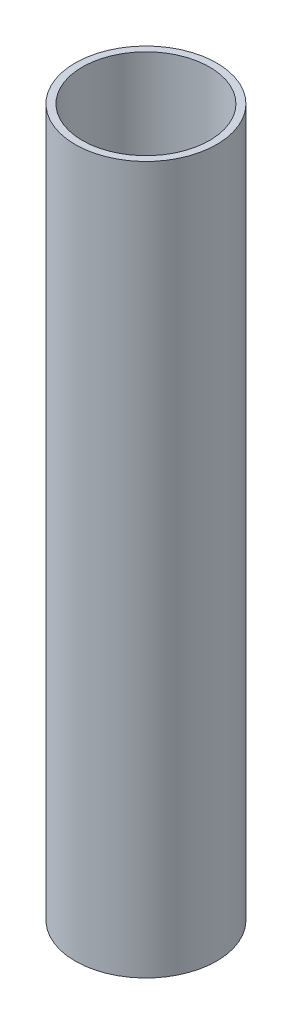
ISO-10303-21;
HEADER;
FILE_DESCRIPTION(('STEP AP214'),'2;1');
FILE_NAME('part.step','',(''),(''),'','','');
FILE_SCHEMA(('AUTOMOTIVE_DESIGN { 1 0 10303 214 1 1 1 1 }'));
ENDSEC;
DATA;
#1=APPLICATION_CONTEXT('core data for automotive mechanical design processes');
#2=APPLICATION_PROTOCOL_DEFINITION('international standard','automotive_design',2000,#1);
#3=PRODUCT_CONTEXT('',#1,'mechanical');
#4=PRODUCT('Part','Part','',(#3));
#5=PRODUCT_RELATED_PRODUCT_CATEGORY('part','',(#4));
#6=PRODUCT_DEFINITION_FORMATION('','',#4);
#7=PRODUCT_DEFINITION_CONTEXT('part definition',#1,'design');
#8=PRODUCT_DEFINITION('design','',#6,#7);
#9=PRODUCT_DEFINITION_SHAPE('','',#8);
#10=(LENGTH_UNIT() NAMED_UNIT(*) SI_UNIT(.MILLI.,.METRE.));
#11=(NAMED_UNIT(*) PLANE_ANGLE_UNIT() SI_UNIT($,.RADIAN.));
#12=(NAMED_UNIT(*) SI_UNIT($,.STERADIAN.) SOLID_ANGLE_UNIT());
#13=UNCERTAINTY_MEASURE_WITH_UNIT(LENGTH_MEASURE(1.E-05),#10,'distance_accuracy_value','');
#14=(GEOMETRIC_REPRESENTATION_CONTEXT(3) GLOBAL_UNCERTAINTY_ASSIGNED_CONTEXT((#13)) GLOBAL_UNIT_ASSIGNED_CONTEXT((#10,
#11,#12)) REPRESENTATION_CONTEXT('',''));
#15=CARTESIAN_POINT('',(0.,0.,0.));
#16=DIRECTION('',(0.,0.,1.));
#17=DIRECTION('',(1.,0.,0.));
#18=AXIS2_PLACEMENT_3D('',#15,#16,#17);
#19=CARTESIAN_POINT('',(0.,200.,0.));
#20=DIRECTION('',(0.,1.,0.));
#21=DIRECTION('',(0.,0.,1.));
#22=AXIS2_PLACEMENT_3D('',#19,#20,#21);
#23=PLANE('',#22);
#24=CARTESIAN_POINT('',(0.,200.,0.));
#25=DIRECTION('',(0.,1.,0.));
#26=DIRECTION('',(0.,0.,1.));
#27=AXIS2_PLACEMENT_3D('',#24,#25,#26);
#28=CIRCLE('',#27,20.);
#29=CARTESIAN_POINT('',(0.,200.,20.));
#30=VERTEX_POINT('',#29);
#31=EDGE_CURVE('E10',#30,#30,#28,.T.);
#32=ORIENTED_EDGE('',*,*,#31,.T.);
#33=EDGE_LOOP('',(#32));
#34=FACE_BOUND('',#33,.T.);
#35=CARTESIAN_POINT('',(0.,200.,0.));
#36=DIRECTION('',(0.,1.,0.));
#37=DIRECTION('',(0.,0.,1.));
#38=AXIS2_PLACEMENT_3D('',#35,#36,#37);
#39=CIRCLE('',#38,18.);
#40=CARTESIAN_POINT('',(0.,200.,18.));
#41=VERTEX_POINT('',#40);
#42=EDGE_CURVE('E48',#41,#41,#39,.T.);
#43=ORIENTED_EDGE('',*,*,#42,.F.);
#44=EDGE_LOOP('',(#43));
#45=FACE_BOUND('',#44,.T.);
#46=ADVANCED_FACE('F37',(#34,#45),#23,.T.);
#47=CARTESIAN_POINT('',(0.,0.,0.));
#48=DIRECTION('',(0.,1.,0.));
#49=DIRECTION('',(0.,0.,1.));
#50=AXIS2_PLACEMENT_3D('',#47,#48,#49);
#51=PLANE('',#50);
#52=CARTESIAN_POINT('',(0.,0.,0.));
#53=DIRECTION('',(0.,1.,0.));
#54=DIRECTION('',(0.,0.,1.));
#55=AXIS2_PLACEMENT_3D('',#52,#53,#54);
#56=CIRCLE('',#55,20.);
#57=CARTESIAN_POINT('',(0.,0.,20.));
#58=VERTEX_POINT('',#57);
#59=EDGE_CURVE('E41',#58,#58,#56,.T.);
#60=ORIENTED_EDGE('',*,*,#59,.F.);
#61=EDGE_LOOP('',(#60));
#62=FACE_BOUND('',#61,.T.);
#63=CARTESIAN_POINT('',(0.,0.,0.));
#64=DIRECTION('',(0.,1.,0.));
#65=DIRECTION('',(0.,0.,1.));
#66=AXIS2_PLACEMENT_3D('',#63,#64,#65);
#67=CIRCLE('',#66,18.);
#68=CARTESIAN_POINT('',(0.,0.,18.));
#69=VERTEX_POINT('',#68);
#70=EDGE_CURVE('E50',#69,#69,#67,.T.);
#71=ORIENTED_EDGE('',*,*,#70,.T.);
#72=EDGE_LOOP('',(#71));
#73=FACE_BOUND('',#72,.T.);
#74=ADVANCED_FACE('F60',(#62,#73),#51,.F.);
#75=CARTESIAN_POINT('',(0.,200.,0.));
#76=DIRECTION('',(0.,-1.,0.));
#77=DIRECTION('',(0.,0.,-1.));
#78=AXIS2_PLACEMENT_3D('',#75,#76,#77);
#79=CYLINDRICAL_SURFACE('',#78,20.);
#80=ORIENTED_EDGE('',*,*,#31,.F.);
#81=EDGE_LOOP('',(#80));
#82=FACE_BOUND('',#81,.T.);
#83=ORIENTED_EDGE('',*,*,#59,.T.);
#84=EDGE_LOOP('',(#83));
#85=FACE_BOUND('',#84,.T.);
#86=ADVANCED_FACE('F39',(#82,#85),#79,.T.);
#87=CARTESIAN_POINT('',(0.,200.,0.));
#88=DIRECTION('',(0.,-1.,0.));
#89=DIRECTION('',(0.,0.,-1.));
#90=AXIS2_PLACEMENT_3D('',#87,#88,#89);
#91=CYLINDRICAL_SURFACE('',#90,18.);
#92=ORIENTED_EDGE('',*,*,#42,.T.);
#93=EDGE_LOOP('',(#92));
#94=FACE_BOUND('',#93,.T.);
#95=ORIENTED_EDGE('',*,*,#70,.F.);
#96=EDGE_LOOP('',(#95));
#97=FACE_BOUND('',#96,.T.);
#98=ADVANCED_FACE('F56',(#94,#97),#91,.F.);
#99=CLOSED_SHELL('',(#46,#74,#86,#98));
#100=MANIFOLD_SOLID_BREP('B2',#99);
#101=ADVANCED_BREP_SHAPE_REPRESENTATION('',(#18,#100),#14);
#102=SHAPE_DEFINITION_REPRESENTATION(#9,#101);
ENDSEC;
END-ISO-10303-21;
